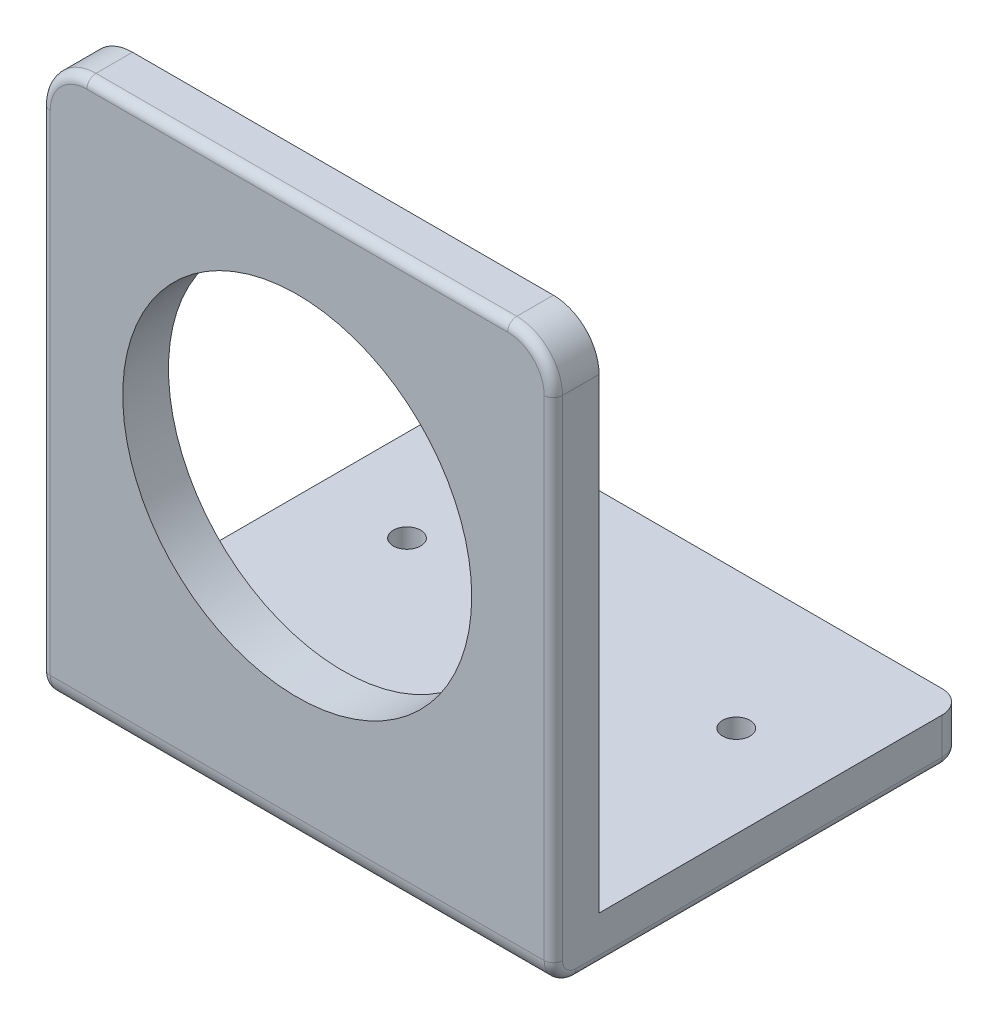
ISO-10303-21;
HEADER;
FILE_DESCRIPTION(('STEP AP214'),'2;1');
FILE_NAME('part.step','',(''),(''),'','','');
FILE_SCHEMA(('AUTOMOTIVE_DESIGN { 1 0 10303 214 1 1 1 1 }'));
ENDSEC;
DATA;
#1=APPLICATION_CONTEXT('core data for automotive mechanical design processes');
#2=APPLICATION_PROTOCOL_DEFINITION('international standard','automotive_design',2000,#1);
#3=PRODUCT_CONTEXT('',#1,'mechanical');
#4=PRODUCT('Part','Part','',(#3));
#5=PRODUCT_RELATED_PRODUCT_CATEGORY('part','',(#4));
#6=PRODUCT_DEFINITION_FORMATION('','',#4);
#7=PRODUCT_DEFINITION_CONTEXT('part definition',#1,'design');
#8=PRODUCT_DEFINITION('design','',#6,#7);
#9=PRODUCT_DEFINITION_SHAPE('','',#8);
#10=(LENGTH_UNIT() NAMED_UNIT(*) SI_UNIT(.MILLI.,.METRE.));
#11=(NAMED_UNIT(*) PLANE_ANGLE_UNIT() SI_UNIT($,.RADIAN.));
#12=(NAMED_UNIT(*) SI_UNIT($,.STERADIAN.) SOLID_ANGLE_UNIT());
#13=UNCERTAINTY_MEASURE_WITH_UNIT(LENGTH_MEASURE(1.E-05),#10,'distance_accuracy_value','');
#14=(GEOMETRIC_REPRESENTATION_CONTEXT(3) GLOBAL_UNCERTAINTY_ASSIGNED_CONTEXT((#13)) GLOBAL_UNIT_ASSIGNED_CONTEXT((#10,
#11,#12)) REPRESENTATION_CONTEXT('',''));
#15=CARTESIAN_POINT('',(0.,0.,0.));
#16=DIRECTION('',(0.,0.,1.));
#17=DIRECTION('',(1.,0.,0.));
#18=AXIS2_PLACEMENT_3D('',#15,#16,#17);
#19=CARTESIAN_POINT('',(28.,23.,5.));
#20=DIRECTION('',(-1.,0.,0.));
#21=DIRECTION('',(0.,-1.,0.));
#22=AXIS2_PLACEMENT_3D('',#19,#20,#21);
#23=PLANE('',#22);
#24=DIRECTION('',(0.,0.,-1.));
#25=VECTOR('',#24,1.);
#26=CARTESIAN_POINT('',(28.,23.,5.));
#27=LINE('',#26,#25);
#28=CARTESIAN_POINT('',(28.,23.,4.));
#29=VERTEX_POINT('',#28);
#30=CARTESIAN_POINT('',(28.,23.,0.));
#31=VERTEX_POINT('',#30);
#32=EDGE_CURVE('E209',#29,#31,#27,.T.);
#33=ORIENTED_EDGE('',*,*,#32,.F.);
#34=DIRECTION('',(0.,1.,0.));
#35=VECTOR('',#34,1.);
#36=CARTESIAN_POINT('',(28.,-30.5,4.));
#37=LINE('',#36,#35);
#38=CARTESIAN_POINT('',(28.,-30.5,4.));
#39=VERTEX_POINT('',#38);
#40=EDGE_CURVE('E251',#29,#39,#37,.F.);
#41=ORIENTED_EDGE('',*,*,#40,.T.);
#42=CARTESIAN_POINT('',(28.,-30.5,2.5));
#43=DIRECTION('',(-1.,0.,0.));
#44=DIRECTION('',(0.,-1.,0.));
#45=AXIS2_PLACEMENT_3D('',#42,#43,#44);
#46=CIRCLE('',#45,1.5);
#47=CARTESIAN_POINT('',(28.,-32.,2.5));
#48=VERTEX_POINT('',#47);
#49=EDGE_CURVE('E249',#39,#48,#46,.F.);
#50=ORIENTED_EDGE('',*,*,#49,.T.);
#51=DIRECTION('',(0.,0.,1.));
#52=VECTOR('',#51,1.);
#53=CARTESIAN_POINT('',(28.,-32.,-37.5));
#54=LINE('',#53,#52);
#55=CARTESIAN_POINT('',(28.,-32.,-37.5));
#56=VERTEX_POINT('',#55);
#57=EDGE_CURVE('E247',#48,#56,#54,.F.);
#58=ORIENTED_EDGE('',*,*,#57,.T.);
#59=DIRECTION('',(0.,-1.,0.));
#60=VECTOR('',#59,1.);
#61=CARTESIAN_POINT('',(28.,-28.,-37.5));
#62=LINE('',#61,#60);
#63=CARTESIAN_POINT('',(28.,-28.,-37.5));
#64=VERTEX_POINT('',#63);
#65=EDGE_CURVE('E159',#56,#64,#62,.F.);
#66=ORIENTED_EDGE('',*,*,#65,.T.);
#67=DIRECTION('',(0.,0.,1.));
#68=VECTOR('',#67,1.);
#69=CARTESIAN_POINT('',(28.,-28.,-50.));
#70=LINE('',#69,#68);
#71=CARTESIAN_POINT('',(28.,-28.,0.));
#72=VERTEX_POINT('',#71);
#73=EDGE_CURVE('E153',#64,#72,#70,.T.);
#74=ORIENTED_EDGE('',*,*,#73,.T.);
#75=DIRECTION('',(0.,1.,0.));
#76=VECTOR('',#75,1.);
#77=CARTESIAN_POINT('',(28.,23.,0.));
#78=LINE('',#77,#76);
#79=EDGE_CURVE('E156',#72,#31,#78,.T.);
#80=ORIENTED_EDGE('',*,*,#79,.T.);
#81=EDGE_LOOP('',(#33,#41,#50,#58,#66,#74,#80));
#82=FACE_BOUND('',#81,.T.);
#83=ADVANCED_FACE('F35',(#82),#23,.F.);
#84=CARTESIAN_POINT('',(-28.,23.,5.));
#85=DIRECTION('',(1.,0.,0.));
#86=DIRECTION('',(0.,1.,0.));
#87=AXIS2_PLACEMENT_3D('',#84,#85,#86);
#88=PLANE('',#87);
#89=DIRECTION('',(0.,1.,0.));
#90=VECTOR('',#89,1.);
#91=CARTESIAN_POINT('',(-28.,-33.,-37.5));
#92=LINE('',#91,#90);
#93=CARTESIAN_POINT('',(-28.,-28.,-37.5));
#94=VERTEX_POINT('',#93);
#95=CARTESIAN_POINT('',(-28.,-32.,-37.5));
#96=VERTEX_POINT('',#95);
#97=EDGE_CURVE('E226',#94,#96,#92,.F.);
#98=ORIENTED_EDGE('',*,*,#97,.T.);
#99=DIRECTION('',(0.,0.,-1.));
#100=VECTOR('',#99,1.);
#101=CARTESIAN_POINT('',(-28.,-32.,2.5));
#102=LINE('',#101,#100);
#103=CARTESIAN_POINT('',(-28.,-32.,2.5));
#104=VERTEX_POINT('',#103);
#105=EDGE_CURVE('E11',#96,#104,#102,.F.);
#106=ORIENTED_EDGE('',*,*,#105,.T.);
#107=CARTESIAN_POINT('',(-28.,-30.5,2.5));
#108=DIRECTION('',(1.,0.,0.));
#109=DIRECTION('',(0.,1.,0.));
#110=AXIS2_PLACEMENT_3D('',#107,#108,#109);
#111=CIRCLE('',#110,1.5);
#112=CARTESIAN_POINT('',(-28.,-30.5,4.));
#113=VERTEX_POINT('',#112);
#114=EDGE_CURVE('E44',#104,#113,#111,.F.);
#115=ORIENTED_EDGE('',*,*,#114,.T.);
#116=DIRECTION('',(0.,-1.,0.));
#117=VECTOR('',#116,1.);
#118=CARTESIAN_POINT('',(-28.,23.,4.));
#119=LINE('',#118,#117);
#120=CARTESIAN_POINT('',(-28.,23.,4.));
#121=VERTEX_POINT('',#120);
#122=EDGE_CURVE('E273',#113,#121,#119,.F.);
#123=ORIENTED_EDGE('',*,*,#122,.T.);
#124=DIRECTION('',(0.,0.,-1.));
#125=VECTOR('',#124,1.);
#126=CARTESIAN_POINT('',(-28.,23.,5.));
#127=LINE('',#126,#125);
#128=CARTESIAN_POINT('',(-28.,23.,0.));
#129=VERTEX_POINT('',#128);
#130=EDGE_CURVE('E203',#121,#129,#127,.T.);
#131=ORIENTED_EDGE('',*,*,#130,.T.);
#132=DIRECTION('',(0.,-1.,0.));
#133=VECTOR('',#132,1.);
#134=CARTESIAN_POINT('',(-28.,23.,0.));
#135=LINE('',#134,#133);
#136=CARTESIAN_POINT('',(-28.,-28.,0.));
#137=VERTEX_POINT('',#136);
#138=EDGE_CURVE('E201',#129,#137,#135,.T.);
#139=ORIENTED_EDGE('',*,*,#138,.T.);
#140=DIRECTION('',(0.,0.,1.));
#141=VECTOR('',#140,1.);
#142=CARTESIAN_POINT('',(-28.,-28.,-50.));
#143=LINE('',#142,#141);
#144=EDGE_CURVE('E163',#94,#137,#143,.T.);
#145=ORIENTED_EDGE('',*,*,#144,.F.);
#146=EDGE_LOOP('',(#98,#106,#115,#123,#131,#139,#145));
#147=FACE_BOUND('',#146,.T.);
#148=ADVANCED_FACE('F353',(#147),#88,.F.);
#149=CARTESIAN_POINT('',(0.,-33.,0.));
#150=DIRECTION('',(0.,-1.,0.));
#151=DIRECTION('',(0.,0.,-1.));
#152=AXIS2_PLACEMENT_3D('',#149,#150,#151);
#153=PLANE('',#152);
#154=CARTESIAN_POINT('',(-18.,-33.,-25.));
#155=DIRECTION('',(0.,1.,0.));
#156=DIRECTION('',(0.,0.,1.));
#157=AXIS2_PLACEMENT_3D('',#154,#155,#156);
#158=CIRCLE('',#157,1.5);
#159=CARTESIAN_POINT('',(-18.,-33.,-23.5));
#160=VERTEX_POINT('',#159);
#161=EDGE_CURVE('E179',#160,#160,#158,.T.);
#162=ORIENTED_EDGE('',*,*,#161,.T.);
#163=EDGE_LOOP('',(#162));
#164=FACE_BOUND('',#163,.T.);
#165=CARTESIAN_POINT('',(18.,-33.,-25.));
#166=DIRECTION('',(0.,1.,0.));
#167=DIRECTION('',(0.,0.,-1.));
#168=AXIS2_PLACEMENT_3D('',#165,#166,#167);
#169=CIRCLE('',#168,1.49999999999999);
#170=CARTESIAN_POINT('',(18.,-33.,-26.5));
#171=VERTEX_POINT('',#170);
#172=EDGE_CURVE('E320',#171,#171,#169,.T.);
#173=ORIENTED_EDGE('',*,*,#172,.T.);
#174=EDGE_LOOP('',(#173));
#175=FACE_BOUND('',#174,.T.);
#176=CARTESIAN_POINT('',(25.5,-33.,-37.5));
#177=DIRECTION('',(0.,-1.,0.));
#178=DIRECTION('',(0.,0.,-1.));
#179=AXIS2_PLACEMENT_3D('',#176,#177,#178);
#180=CIRCLE('',#179,1.5);
#181=CARTESIAN_POINT('',(25.5,-33.,-39.));
#182=VERTEX_POINT('',#181);
#183=CARTESIAN_POINT('',(27.,-33.,-37.5));
#184=VERTEX_POINT('',#183);
#185=EDGE_CURVE('E263',#182,#184,#180,.T.);
#186=ORIENTED_EDGE('',*,*,#185,.T.);
#187=DIRECTION('',(0.,0.,1.));
#188=VECTOR('',#187,1.);
#189=CARTESIAN_POINT('',(27.,-33.,2.5));
#190=LINE('',#189,#188);
#191=CARTESIAN_POINT('',(27.,-33.,2.5));
#192=VERTEX_POINT('',#191);
#193=EDGE_CURVE('E265',#184,#192,#190,.T.);
#194=ORIENTED_EDGE('',*,*,#193,.T.);
#195=DIRECTION('',(-1.,0.,0.));
#196=VECTOR('',#195,1.);
#197=CARTESIAN_POINT('',(0.,-33.,2.5));
#198=LINE('',#197,#196);
#199=CARTESIAN_POINT('',(-27.,-33.,2.5));
#200=VERTEX_POINT('',#199);
#201=EDGE_CURVE('E211',#192,#200,#198,.T.);
#202=ORIENTED_EDGE('',*,*,#201,.T.);
#203=DIRECTION('',(0.,0.,-1.));
#204=VECTOR('',#203,1.);
#205=CARTESIAN_POINT('',(-27.,-33.,-37.5));
#206=LINE('',#205,#204);
#207=CARTESIAN_POINT('',(-27.,-33.,-37.5));
#208=VERTEX_POINT('',#207);
#209=EDGE_CURVE('E257',#200,#208,#206,.T.);
#210=ORIENTED_EDGE('',*,*,#209,.T.);
#211=CARTESIAN_POINT('',(-25.5,-33.,-37.5));
#212=DIRECTION('',(0.,-1.,0.));
#213=DIRECTION('',(0.,0.,-1.));
#214=AXIS2_PLACEMENT_3D('',#211,#212,#213);
#215=CIRCLE('',#214,1.5);
#216=CARTESIAN_POINT('',(-25.5,-33.,-39.));
#217=VERTEX_POINT('',#216);
#218=EDGE_CURVE('E259',#208,#217,#215,.T.);
#219=ORIENTED_EDGE('',*,*,#218,.T.);
#220=DIRECTION('',(-1.,0.,0.));
#221=VECTOR('',#220,1.);
#222=CARTESIAN_POINT('',(0.,-33.,-39.));
#223=LINE('',#222,#221);
#224=EDGE_CURVE('E261',#217,#182,#223,.F.);
#225=ORIENTED_EDGE('',*,*,#224,.T.);
#226=EDGE_LOOP('',(#186,#194,#202,#210,#219,#225));
#227=FACE_BOUND('',#226,.T.);
#228=ADVANCED_FACE('F326',(#164,#175,#227),#153,.T.);
#229=CARTESIAN_POINT('',(28.,-28.,-50.));
#230=DIRECTION('',(0.,-1.,0.));
#231=DIRECTION('',(0.,0.,-1.));
#232=AXIS2_PLACEMENT_3D('',#229,#230,#231);
#233=PLANE('',#232);
#234=CARTESIAN_POINT('',(18.,-28.,-25.));
#235=DIRECTION('',(0.,1.,0.));
#236=DIRECTION('',(0.,0.,-1.));
#237=AXIS2_PLACEMENT_3D('',#234,#235,#236);
#238=CIRCLE('',#237,1.49999999999999);
#239=CARTESIAN_POINT('',(18.,-28.,-26.5));
#240=VERTEX_POINT('',#239);
#241=EDGE_CURVE('E185',#240,#240,#238,.T.);
#242=ORIENTED_EDGE('',*,*,#241,.F.);
#243=EDGE_LOOP('',(#242));
#244=FACE_BOUND('',#243,.T.);
#245=CARTESIAN_POINT('',(-18.,-28.,-25.));
#246=DIRECTION('',(0.,1.,0.));
#247=DIRECTION('',(0.,0.,1.));
#248=AXIS2_PLACEMENT_3D('',#245,#246,#247);
#249=CIRCLE('',#248,1.5);
#250=CARTESIAN_POINT('',(-18.,-28.,-23.5));
#251=VERTEX_POINT('',#250);
#252=EDGE_CURVE('E182',#251,#251,#249,.T.);
#253=ORIENTED_EDGE('',*,*,#252,.F.);
#254=EDGE_LOOP('',(#253));
#255=FACE_BOUND('',#254,.T.);
#256=DIRECTION('',(1.,0.,0.));
#257=VECTOR('',#256,1.);
#258=CARTESIAN_POINT('',(-28.,-28.,-40.));
#259=LINE('',#258,#257);
#260=CARTESIAN_POINT('',(-25.5,-28.,-40.));
#261=VERTEX_POINT('',#260);
#262=CARTESIAN_POINT('',(25.5,-28.,-40.));
#263=VERTEX_POINT('',#262);
#264=EDGE_CURVE('E310',#261,#263,#259,.T.);
#265=ORIENTED_EDGE('',*,*,#264,.F.);
#266=CARTESIAN_POINT('',(-25.5,-28.,-37.5));
#267=DIRECTION('',(0.,-1.,0.));
#268=DIRECTION('',(0.,0.,-1.));
#269=AXIS2_PLACEMENT_3D('',#266,#267,#268);
#270=CIRCLE('',#269,2.5);
#271=EDGE_CURVE('E224',#261,#94,#270,.F.);
#272=ORIENTED_EDGE('',*,*,#271,.T.);
#273=ORIENTED_EDGE('',*,*,#144,.T.);
#274=DIRECTION('',(1.,0.,0.));
#275=VECTOR('',#274,1.);
#276=CARTESIAN_POINT('',(28.,-28.,0.));
#277=LINE('',#276,#275);
#278=EDGE_CURVE('E164',#137,#72,#277,.T.);
#279=ORIENTED_EDGE('',*,*,#278,.T.);
#280=ORIENTED_EDGE('',*,*,#73,.F.);
#281=CARTESIAN_POINT('',(25.5,-28.,-37.5));
#282=DIRECTION('',(0.,-1.,0.));
#283=DIRECTION('',(0.,0.,-1.));
#284=AXIS2_PLACEMENT_3D('',#281,#282,#283);
#285=CIRCLE('',#284,2.5);
#286=EDGE_CURVE('E222',#64,#263,#285,.F.);
#287=ORIENTED_EDGE('',*,*,#286,.T.);
#288=EDGE_LOOP('',(#265,#272,#273,#279,#280,#287));
#289=FACE_BOUND('',#288,.T.);
#290=ADVANCED_FACE('F177',(#244,#255,#289),#233,.F.);
#291=CARTESIAN_POINT('',(-23.,23.,0.));
#292=DIRECTION('',(0.,0.,1.));
#293=DIRECTION('',(1.,0.,0.));
#294=AXIS2_PLACEMENT_3D('',#291,#292,#293);
#295=PLANE('',#294);
#296=CARTESIAN_POINT('',(0.,0.,0.));
#297=DIRECTION('',(0.,0.,1.));
#298=DIRECTION('',(1.,0.,0.));
#299=AXIS2_PLACEMENT_3D('',#296,#297,#298);
#300=CIRCLE('',#299,19.075);
#301=CARTESIAN_POINT('',(19.075,0.,0.));
#302=VERTEX_POINT('',#301);
#303=EDGE_CURVE('E189',#302,#302,#300,.T.);
#304=ORIENTED_EDGE('',*,*,#303,.T.);
#305=EDGE_LOOP('',(#304));
#306=FACE_BOUND('',#305,.T.);
#307=ORIENTED_EDGE('',*,*,#278,.F.);
#308=ORIENTED_EDGE('',*,*,#138,.F.);
#309=CARTESIAN_POINT('',(-23.,23.,0.));
#310=DIRECTION('',(0.,0.,1.));
#311=DIRECTION('',(1.,0.,0.));
#312=AXIS2_PLACEMENT_3D('',#309,#310,#311);
#313=CIRCLE('',#312,5.);
#314=CARTESIAN_POINT('',(-23.,28.,0.));
#315=VERTEX_POINT('',#314);
#316=EDGE_CURVE('E198',#315,#129,#313,.T.);
#317=ORIENTED_EDGE('',*,*,#316,.F.);
#318=DIRECTION('',(-1.,0.,0.));
#319=VECTOR('',#318,1.);
#320=CARTESIAN_POINT('',(-23.,28.,0.));
#321=LINE('',#320,#319);
#322=CARTESIAN_POINT('',(23.,28.,0.));
#323=VERTEX_POINT('',#322);
#324=EDGE_CURVE('E195',#323,#315,#321,.T.);
#325=ORIENTED_EDGE('',*,*,#324,.F.);
#326=CARTESIAN_POINT('',(23.,23.,0.));
#327=DIRECTION('',(0.,0.,1.));
#328=DIRECTION('',(-1.,0.,0.));
#329=AXIS2_PLACEMENT_3D('',#326,#327,#328);
#330=CIRCLE('',#329,5.);
#331=EDGE_CURVE('E173',#31,#323,#330,.T.);
#332=ORIENTED_EDGE('',*,*,#331,.F.);
#333=ORIENTED_EDGE('',*,*,#79,.F.);
#334=EDGE_LOOP('',(#307,#308,#317,#325,#332,#333));
#335=FACE_BOUND('',#334,.T.);
#336=ADVANCED_FACE('F168',(#306,#335),#295,.F.);
#337=CARTESIAN_POINT('',(-23.,23.,5.));
#338=DIRECTION('',(0.,0.,1.));
#339=DIRECTION('',(1.,0.,0.));
#340=AXIS2_PLACEMENT_3D('',#337,#338,#339);
#341=PLANE('',#340);
#342=DIRECTION('',(-1.,0.,0.));
#343=VECTOR('',#342,1.);
#344=CARTESIAN_POINT('',(-23.,-30.5,5.));
#345=LINE('',#344,#343);
#346=CARTESIAN_POINT('',(-27.,-30.5,5.));
#347=VERTEX_POINT('',#346);
#348=CARTESIAN_POINT('',(27.,-30.5,5.));
#349=VERTEX_POINT('',#348);
#350=EDGE_CURVE('E214',#347,#349,#345,.F.);
#351=ORIENTED_EDGE('',*,*,#350,.T.);
#352=DIRECTION('',(0.,1.,0.));
#353=VECTOR('',#352,1.);
#354=CARTESIAN_POINT('',(27.,23.,5.));
#355=LINE('',#354,#353);
#356=CARTESIAN_POINT('',(27.,23.,5.));
#357=VERTEX_POINT('',#356);
#358=EDGE_CURVE('E238',#349,#357,#355,.T.);
#359=ORIENTED_EDGE('',*,*,#358,.T.);
#360=CARTESIAN_POINT('',(23.,23.,5.));
#361=DIRECTION('',(0.,0.,1.));
#362=DIRECTION('',(1.,0.,0.));
#363=AXIS2_PLACEMENT_3D('',#360,#361,#362);
#364=CIRCLE('',#363,4.);
#365=CARTESIAN_POINT('',(23.,27.,5.));
#366=VERTEX_POINT('',#365);
#367=EDGE_CURVE('E236',#357,#366,#364,.T.);
#368=ORIENTED_EDGE('',*,*,#367,.T.);
#369=DIRECTION('',(-1.,0.,0.));
#370=VECTOR('',#369,1.);
#371=CARTESIAN_POINT('',(-23.,27.,5.));
#372=LINE('',#371,#370);
#373=CARTESIAN_POINT('',(-23.,27.,5.));
#374=VERTEX_POINT('',#373);
#375=EDGE_CURVE('E234',#366,#374,#372,.T.);
#376=ORIENTED_EDGE('',*,*,#375,.T.);
#377=CARTESIAN_POINT('',(-23.,23.,5.));
#378=DIRECTION('',(0.,0.,1.));
#379=DIRECTION('',(1.,0.,0.));
#380=AXIS2_PLACEMENT_3D('',#377,#378,#379);
#381=CIRCLE('',#380,4.);
#382=CARTESIAN_POINT('',(-27.,23.,5.));
#383=VERTEX_POINT('',#382);
#384=EDGE_CURVE('E231',#374,#383,#381,.T.);
#385=ORIENTED_EDGE('',*,*,#384,.T.);
#386=DIRECTION('',(0.,-1.,0.));
#387=VECTOR('',#386,1.);
#388=CARTESIAN_POINT('',(-27.,-30.5,5.));
#389=LINE('',#388,#387);
#390=EDGE_CURVE('E229',#383,#347,#389,.T.);
#391=ORIENTED_EDGE('',*,*,#390,.T.);
#392=EDGE_LOOP('',(#351,#359,#368,#376,#385,#391));
#393=FACE_BOUND('',#392,.T.);
#394=CARTESIAN_POINT('',(0.,0.,5.));
#395=DIRECTION('',(0.,0.,1.));
#396=DIRECTION('',(1.,0.,0.));
#397=AXIS2_PLACEMENT_3D('',#394,#395,#396);
#398=CIRCLE('',#397,19.075);
#399=CARTESIAN_POINT('',(19.075,0.,5.));
#400=VERTEX_POINT('',#399);
#401=EDGE_CURVE('E174',#400,#400,#398,.T.);
#402=ORIENTED_EDGE('',*,*,#401,.F.);
#403=EDGE_LOOP('',(#402));
#404=FACE_BOUND('',#403,.T.);
#405=ADVANCED_FACE('F449',(#393,#404),#341,.T.);
#406=CARTESIAN_POINT('',(23.,23.,5.));
#407=DIRECTION('',(0.,0.,-1.));
#408=DIRECTION('',(-1.,0.,0.));
#409=AXIS2_PLACEMENT_3D('',#406,#407,#408);
#410=CYLINDRICAL_SURFACE('',#409,5.);
#411=DIRECTION('',(0.,0.,-1.));
#412=VECTOR('',#411,1.);
#413=CARTESIAN_POINT('',(23.,28.,5.));
#414=LINE('',#413,#412);
#415=CARTESIAN_POINT('',(23.,28.,4.));
#416=VERTEX_POINT('',#415);
#417=EDGE_CURVE('E207',#416,#323,#414,.T.);
#418=ORIENTED_EDGE('',*,*,#417,.F.);
#419=CARTESIAN_POINT('',(23.,23.,4.));
#420=DIRECTION('',(0.,0.,1.));
#421=DIRECTION('',(1.,0.,0.));
#422=AXIS2_PLACEMENT_3D('',#419,#420,#421);
#423=CIRCLE('',#422,5.);
#424=EDGE_CURVE('E245',#416,#29,#423,.F.);
#425=ORIENTED_EDGE('',*,*,#424,.T.);
#426=ORIENTED_EDGE('',*,*,#32,.T.);
#427=ORIENTED_EDGE('',*,*,#331,.T.);
#428=EDGE_LOOP('',(#418,#425,#426,#427));
#429=FACE_BOUND('',#428,.T.);
#430=ADVANCED_FACE('F361',(#429),#410,.T.);
#431=CARTESIAN_POINT('',(-23.,28.,5.));
#432=DIRECTION('',(0.,-1.,0.));
#433=DIRECTION('',(0.,0.,-1.));
#434=AXIS2_PLACEMENT_3D('',#431,#432,#433);
#435=PLANE('',#434);
#436=DIRECTION('',(0.,0.,-1.));
#437=VECTOR('',#436,1.);
#438=CARTESIAN_POINT('',(-23.,28.,5.));
#439=LINE('',#438,#437);
#440=CARTESIAN_POINT('',(-23.,28.,4.));
#441=VERTEX_POINT('',#440);
#442=EDGE_CURVE('E205',#441,#315,#439,.T.);
#443=ORIENTED_EDGE('',*,*,#442,.F.);
#444=DIRECTION('',(-1.,0.,0.));
#445=VECTOR('',#444,1.);
#446=CARTESIAN_POINT('',(23.,28.,4.));
#447=LINE('',#446,#445);
#448=EDGE_CURVE('E243',#441,#416,#447,.F.);
#449=ORIENTED_EDGE('',*,*,#448,.T.);
#450=ORIENTED_EDGE('',*,*,#417,.T.);
#451=ORIENTED_EDGE('',*,*,#324,.T.);
#452=EDGE_LOOP('',(#443,#449,#450,#451));
#453=FACE_BOUND('',#452,.T.);
#454=ADVANCED_FACE('F435',(#453),#435,.F.);
#455=CARTESIAN_POINT('',(-23.,23.,5.));
#456=DIRECTION('',(0.,0.,-1.));
#457=DIRECTION('',(-1.,0.,0.));
#458=AXIS2_PLACEMENT_3D('',#455,#456,#457);
#459=CYLINDRICAL_SURFACE('',#458,5.);
#460=ORIENTED_EDGE('',*,*,#130,.F.);
#461=CARTESIAN_POINT('',(-23.,23.,4.));
#462=DIRECTION('',(0.,0.,1.));
#463=DIRECTION('',(1.,0.,0.));
#464=AXIS2_PLACEMENT_3D('',#461,#462,#463);
#465=CIRCLE('',#464,5.);
#466=EDGE_CURVE('E240',#121,#441,#465,.F.);
#467=ORIENTED_EDGE('',*,*,#466,.T.);
#468=ORIENTED_EDGE('',*,*,#442,.T.);
#469=ORIENTED_EDGE('',*,*,#316,.T.);
#470=EDGE_LOOP('',(#460,#467,#468,#469));
#471=FACE_BOUND('',#470,.T.);
#472=ADVANCED_FACE('F431',(#471),#459,.T.);
#473=CARTESIAN_POINT('',(0.,0.,5.));
#474=DIRECTION('',(0.,0.,-1.));
#475=DIRECTION('',(-1.,0.,0.));
#476=AXIS2_PLACEMENT_3D('',#473,#474,#475);
#477=CYLINDRICAL_SURFACE('',#476,19.075);
#478=ORIENTED_EDGE('',*,*,#401,.T.);
#479=EDGE_LOOP('',(#478));
#480=FACE_BOUND('',#479,.T.);
#481=ORIENTED_EDGE('',*,*,#303,.F.);
#482=EDGE_LOOP('',(#481));
#483=FACE_BOUND('',#482,.T.);
#484=ADVANCED_FACE('F365',(#480,#483),#477,.F.);
#485=CARTESIAN_POINT('',(0.,-30.5,2.5));
#486=DIRECTION('',(-1.,0.,0.));
#487=DIRECTION('',(0.,0.,1.));
#488=AXIS2_PLACEMENT_3D('',#485,#486,#487);
#489=CYLINDRICAL_SURFACE('',#488,2.5);
#490=ORIENTED_EDGE('',*,*,#201,.F.);
#491=CARTESIAN_POINT('',(27.,-30.5,2.5));
#492=DIRECTION('',(-1.,0.,0.));
#493=DIRECTION('',(0.,-1.,0.));
#494=AXIS2_PLACEMENT_3D('',#491,#492,#493);
#495=CIRCLE('',#494,2.5);
#496=EDGE_CURVE('E255',#192,#349,#495,.T.);
#497=ORIENTED_EDGE('',*,*,#496,.T.);
#498=ORIENTED_EDGE('',*,*,#350,.F.);
#499=CARTESIAN_POINT('',(-27.,-30.5,2.5));
#500=DIRECTION('',(1.,0.,0.));
#501=DIRECTION('',(0.,1.,0.));
#502=AXIS2_PLACEMENT_3D('',#499,#500,#501);
#503=CIRCLE('',#502,2.5);
#504=EDGE_CURVE('E253',#347,#200,#503,.T.);
#505=ORIENTED_EDGE('',*,*,#504,.T.);
#506=EDGE_LOOP('',(#490,#497,#498,#505));
#507=FACE_BOUND('',#506,.T.);
#508=ADVANCED_FACE('F333',(#507),#489,.T.);
#509=CARTESIAN_POINT('',(18.,-33.,-25.));
#510=DIRECTION('',(0.,1.,0.));
#511=DIRECTION('',(0.,0.,1.));
#512=AXIS2_PLACEMENT_3D('',#509,#510,#511);
#513=CYLINDRICAL_SURFACE('',#512,1.49999999999999);
#514=ORIENTED_EDGE('',*,*,#172,.F.);
#515=EDGE_LOOP('',(#514));
#516=FACE_BOUND('',#515,.T.);
#517=ORIENTED_EDGE('',*,*,#241,.T.);
#518=EDGE_LOOP('',(#517));
#519=FACE_BOUND('',#518,.T.);
#520=ADVANCED_FACE('F329',(#516,#519),#513,.F.);
#521=CARTESIAN_POINT('',(-18.,-33.,-25.));
#522=DIRECTION('',(0.,1.,0.));
#523=DIRECTION('',(0.,0.,1.));
#524=AXIS2_PLACEMENT_3D('',#521,#522,#523);
#525=CYLINDRICAL_SURFACE('',#524,1.5);
#526=ORIENTED_EDGE('',*,*,#161,.F.);
#527=EDGE_LOOP('',(#526));
#528=FACE_BOUND('',#527,.T.);
#529=ORIENTED_EDGE('',*,*,#252,.T.);
#530=EDGE_LOOP('',(#529));
#531=FACE_BOUND('',#530,.T.);
#532=ADVANCED_FACE('F332',(#528,#531),#525,.F.);
#533=CARTESIAN_POINT('',(0.,0.,-40.));
#534=DIRECTION('',(0.,0.,-1.));
#535=DIRECTION('',(-1.,0.,0.));
#536=AXIS2_PLACEMENT_3D('',#533,#534,#535);
#537=PLANE('',#536);
#538=DIRECTION('',(0.,-1.,0.));
#539=VECTOR('',#538,1.);
#540=CARTESIAN_POINT('',(25.5,-33.,-40.));
#541=LINE('',#540,#539);
#542=CARTESIAN_POINT('',(25.5,-32.,-40.));
#543=VERTEX_POINT('',#542);
#544=EDGE_CURVE('E217',#263,#543,#541,.T.);
#545=ORIENTED_EDGE('',*,*,#544,.T.);
#546=DIRECTION('',(-1.,0.,0.));
#547=VECTOR('',#546,1.);
#548=CARTESIAN_POINT('',(0.,-32.,-40.));
#549=LINE('',#548,#547);
#550=CARTESIAN_POINT('',(-25.5,-32.,-40.));
#551=VERTEX_POINT('',#550);
#552=EDGE_CURVE('E269',#543,#551,#549,.T.);
#553=ORIENTED_EDGE('',*,*,#552,.T.);
#554=DIRECTION('',(0.,1.,0.));
#555=VECTOR('',#554,1.);
#556=CARTESIAN_POINT('',(-25.5,-28.,-40.));
#557=LINE('',#556,#555);
#558=EDGE_CURVE('E220',#551,#261,#557,.T.);
#559=ORIENTED_EDGE('',*,*,#558,.T.);
#560=ORIENTED_EDGE('',*,*,#264,.T.);
#561=EDGE_LOOP('',(#545,#553,#559,#560));
#562=FACE_BOUND('',#561,.T.);
#563=ADVANCED_FACE('F343',(#562),#537,.T.);
#564=CARTESIAN_POINT('',(-25.5,0.,-37.5));
#565=DIRECTION('',(0.,-1.,0.));
#566=DIRECTION('',(1.,0.,0.));
#567=AXIS2_PLACEMENT_3D('',#564,#565,#566);
#568=CYLINDRICAL_SURFACE('',#567,2.5);
#569=ORIENTED_EDGE('',*,*,#558,.F.);
#570=CARTESIAN_POINT('',(-25.5,-32.,-37.5));
#571=DIRECTION('',(0.,-1.,0.));
#572=DIRECTION('',(0.,0.,-1.));
#573=AXIS2_PLACEMENT_3D('',#570,#571,#572);
#574=CIRCLE('',#573,2.5);
#575=EDGE_CURVE('E271',#551,#96,#574,.F.);
#576=ORIENTED_EDGE('',*,*,#575,.T.);
#577=ORIENTED_EDGE('',*,*,#97,.F.);
#578=ORIENTED_EDGE('',*,*,#271,.F.);
#579=EDGE_LOOP('',(#569,#576,#577,#578));
#580=FACE_BOUND('',#579,.T.);
#581=ADVANCED_FACE('F349',(#580),#568,.T.);
#582=CARTESIAN_POINT('',(25.5,0.,-37.5));
#583=DIRECTION('',(0.,1.,0.));
#584=DIRECTION('',(-1.,0.,0.));
#585=AXIS2_PLACEMENT_3D('',#582,#583,#584);
#586=CYLINDRICAL_SURFACE('',#585,2.5);
#587=ORIENTED_EDGE('',*,*,#65,.F.);
#588=CARTESIAN_POINT('',(25.5,-32.,-37.5));
#589=DIRECTION('',(0.,-1.,0.));
#590=DIRECTION('',(0.,0.,-1.));
#591=AXIS2_PLACEMENT_3D('',#588,#589,#590);
#592=CIRCLE('',#591,2.5);
#593=EDGE_CURVE('E267',#56,#543,#592,.F.);
#594=ORIENTED_EDGE('',*,*,#593,.T.);
#595=ORIENTED_EDGE('',*,*,#544,.F.);
#596=ORIENTED_EDGE('',*,*,#286,.F.);
#597=EDGE_LOOP('',(#587,#594,#595,#596));
#598=FACE_BOUND('',#597,.T.);
#599=ADVANCED_FACE('F369',(#598),#586,.T.);
#600=CARTESIAN_POINT('',(25.5,-32.,-37.5));
#601=DIRECTION('',(0.,-1.,0.));
#602=DIRECTION('',(0.,0.,-1.));
#603=AXIS2_PLACEMENT_3D('',#600,#601,#602);
#604=TOROIDAL_SURFACE('',#603,1.5,1.);
#605=CARTESIAN_POINT('',(25.5,-32.,-39.));
#606=DIRECTION('',(-1.,0.,0.));
#607=DIRECTION('',(0.,0.,1.));
#608=AXIS2_PLACEMENT_3D('',#605,#606,#607);
#609=CIRCLE('',#608,1.);
#610=EDGE_CURVE('E303',#543,#182,#609,.T.);
#611=ORIENTED_EDGE('',*,*,#610,.F.);
#612=ORIENTED_EDGE('',*,*,#593,.F.);
#613=CARTESIAN_POINT('',(27.,-32.,-37.5));
#614=DIRECTION('',(0.,0.,1.));
#615=DIRECTION('',(1.,0.,0.));
#616=AXIS2_PLACEMENT_3D('',#613,#614,#615);
#617=CIRCLE('',#616,1.);
#618=EDGE_CURVE('E39',#184,#56,#617,.T.);
#619=ORIENTED_EDGE('',*,*,#618,.F.);
#620=ORIENTED_EDGE('',*,*,#185,.F.);
#621=EDGE_LOOP('',(#611,#612,#619,#620));
#622=FACE_BOUND('',#621,.T.);
#623=ADVANCED_FACE('F37',(#622),#604,.T.);
#624=CARTESIAN_POINT('',(27.,-32.,0.));
#625=DIRECTION('',(0.,0.,-1.));
#626=DIRECTION('',(-1.,0.,0.));
#627=AXIS2_PLACEMENT_3D('',#624,#625,#626);
#628=CYLINDRICAL_SURFACE('',#627,1.);
#629=ORIENTED_EDGE('',*,*,#618,.T.);
#630=ORIENTED_EDGE('',*,*,#57,.F.);
#631=CARTESIAN_POINT('',(27.,-32.,2.5));
#632=DIRECTION('',(0.,0.,1.));
#633=DIRECTION('',(1.,0.,0.));
#634=AXIS2_PLACEMENT_3D('',#631,#632,#633);
#635=CIRCLE('',#634,1.);
#636=EDGE_CURVE('E301',#192,#48,#635,.T.);
#637=ORIENTED_EDGE('',*,*,#636,.F.);
#638=ORIENTED_EDGE('',*,*,#193,.F.);
#639=EDGE_LOOP('',(#629,#630,#637,#638));
#640=FACE_BOUND('',#639,.T.);
#641=ADVANCED_FACE('F412',(#640),#628,.T.);
#642=CARTESIAN_POINT('',(0.,-32.,-39.));
#643=DIRECTION('',(-1.,0.,0.));
#644=DIRECTION('',(0.,0.,1.));
#645=AXIS2_PLACEMENT_3D('',#642,#643,#644);
#646=CYLINDRICAL_SURFACE('',#645,1.);
#647=ORIENTED_EDGE('',*,*,#610,.T.);
#648=ORIENTED_EDGE('',*,*,#224,.F.);
#649=CARTESIAN_POINT('',(-25.5,-32.,-39.));
#650=DIRECTION('',(-1.,0.,0.));
#651=DIRECTION('',(0.,0.,1.));
#652=AXIS2_PLACEMENT_3D('',#649,#650,#651);
#653=CIRCLE('',#652,1.);
#654=EDGE_CURVE('E298',#551,#217,#653,.T.);
#655=ORIENTED_EDGE('',*,*,#654,.F.);
#656=ORIENTED_EDGE('',*,*,#552,.F.);
#657=EDGE_LOOP('',(#647,#648,#655,#656));
#658=FACE_BOUND('',#657,.T.);
#659=ADVANCED_FACE('F409',(#658),#646,.T.);
#660=CARTESIAN_POINT('',(27.,-30.5,2.5));
#661=DIRECTION('',(-1.,0.,0.));
#662=DIRECTION('',(0.,-1.,0.));
#663=AXIS2_PLACEMENT_3D('',#660,#661,#662);
#664=TOROIDAL_SURFACE('',#663,1.5,1.);
#665=ORIENTED_EDGE('',*,*,#636,.T.);
#666=ORIENTED_EDGE('',*,*,#49,.F.);
#667=CARTESIAN_POINT('',(27.,-30.5,4.));
#668=DIRECTION('',(0.,1.,0.));
#669=DIRECTION('',(0.,0.,1.));
#670=AXIS2_PLACEMENT_3D('',#667,#668,#669);
#671=CIRCLE('',#670,1.);
#672=EDGE_CURVE('E295',#349,#39,#671,.T.);
#673=ORIENTED_EDGE('',*,*,#672,.F.);
#674=ORIENTED_EDGE('',*,*,#496,.F.);
#675=EDGE_LOOP('',(#665,#666,#673,#674));
#676=FACE_BOUND('',#675,.T.);
#677=ADVANCED_FACE('F405',(#676),#664,.T.);
#678=CARTESIAN_POINT('',(-25.5,-32.,-37.5));
#679=DIRECTION('',(0.,-1.,0.));
#680=DIRECTION('',(0.,0.,-1.));
#681=AXIS2_PLACEMENT_3D('',#678,#679,#680);
#682=TOROIDAL_SURFACE('',#681,1.5,1.);
#683=ORIENTED_EDGE('',*,*,#654,.T.);
#684=ORIENTED_EDGE('',*,*,#218,.F.);
#685=CARTESIAN_POINT('',(-27.,-32.,-37.5));
#686=DIRECTION('',(0.,0.,1.));
#687=DIRECTION('',(1.,0.,0.));
#688=AXIS2_PLACEMENT_3D('',#685,#686,#687);
#689=CIRCLE('',#688,1.);
#690=EDGE_CURVE('E292',#96,#208,#689,.T.);
#691=ORIENTED_EDGE('',*,*,#690,.F.);
#692=ORIENTED_EDGE('',*,*,#575,.F.);
#693=EDGE_LOOP('',(#683,#684,#691,#692));
#694=FACE_BOUND('',#693,.T.);
#695=ADVANCED_FACE('F401',(#694),#682,.T.);
#696=CARTESIAN_POINT('',(27.,23.,4.));
#697=DIRECTION('',(0.,-1.,0.));
#698=DIRECTION('',(1.,0.,0.));
#699=AXIS2_PLACEMENT_3D('',#696,#697,#698);
#700=CYLINDRICAL_SURFACE('',#699,1.);
#701=ORIENTED_EDGE('',*,*,#672,.T.);
#702=ORIENTED_EDGE('',*,*,#40,.F.);
#703=CARTESIAN_POINT('',(27.,23.,4.));
#704=DIRECTION('',(0.,1.,0.));
#705=DIRECTION('',(-1.,0.,0.));
#706=AXIS2_PLACEMENT_3D('',#703,#704,#705);
#707=CIRCLE('',#706,1.);
#708=EDGE_CURVE('E289',#357,#29,#707,.T.);
#709=ORIENTED_EDGE('',*,*,#708,.F.);
#710=ORIENTED_EDGE('',*,*,#358,.F.);
#711=EDGE_LOOP('',(#701,#702,#709,#710));
#712=FACE_BOUND('',#711,.T.);
#713=ADVANCED_FACE('F397',(#712),#700,.T.);
#714=CARTESIAN_POINT('',(-27.,-32.,0.));
#715=DIRECTION('',(0.,0.,1.));
#716=DIRECTION('',(1.,0.,0.));
#717=AXIS2_PLACEMENT_3D('',#714,#715,#716);
#718=CYLINDRICAL_SURFACE('',#717,1.);
#719=ORIENTED_EDGE('',*,*,#690,.T.);
#720=ORIENTED_EDGE('',*,*,#209,.F.);
#721=CARTESIAN_POINT('',(-27.,-32.,2.5));
#722=DIRECTION('',(0.,0.,1.));
#723=DIRECTION('',(1.,0.,0.));
#724=AXIS2_PLACEMENT_3D('',#721,#722,#723);
#725=CIRCLE('',#724,1.);
#726=EDGE_CURVE('E286',#104,#200,#725,.T.);
#727=ORIENTED_EDGE('',*,*,#726,.F.);
#728=ORIENTED_EDGE('',*,*,#105,.F.);
#729=EDGE_LOOP('',(#719,#720,#727,#728));
#730=FACE_BOUND('',#729,.T.);
#731=ADVANCED_FACE('F393',(#730),#718,.T.);
#732=CARTESIAN_POINT('',(23.,23.,4.));
#733=DIRECTION('',(0.,0.,1.));
#734=DIRECTION('',(1.,0.,0.));
#735=AXIS2_PLACEMENT_3D('',#732,#733,#734);
#736=TOROIDAL_SURFACE('',#735,4.,1.);
#737=ORIENTED_EDGE('',*,*,#708,.T.);
#738=ORIENTED_EDGE('',*,*,#424,.F.);
#739=CARTESIAN_POINT('',(23.,27.,4.));
#740=DIRECTION('',(-1.,0.,0.));
#741=DIRECTION('',(0.,0.,1.));
#742=AXIS2_PLACEMENT_3D('',#739,#740,#741);
#743=CIRCLE('',#742,1.);
#744=EDGE_CURVE('E283',#366,#416,#743,.T.);
#745=ORIENTED_EDGE('',*,*,#744,.F.);
#746=ORIENTED_EDGE('',*,*,#367,.F.);
#747=EDGE_LOOP('',(#737,#738,#745,#746));
#748=FACE_BOUND('',#747,.T.);
#749=ADVANCED_FACE('F389',(#748),#736,.T.);
#750=CARTESIAN_POINT('',(-27.,-30.5,2.5));
#751=DIRECTION('',(1.,0.,0.));
#752=DIRECTION('',(0.,1.,0.));
#753=AXIS2_PLACEMENT_3D('',#750,#751,#752);
#754=TOROIDAL_SURFACE('',#753,1.5,1.);
#755=ORIENTED_EDGE('',*,*,#726,.T.);
#756=ORIENTED_EDGE('',*,*,#504,.F.);
#757=CARTESIAN_POINT('',(-27.,-30.5,4.));
#758=DIRECTION('',(0.,1.,0.));
#759=DIRECTION('',(0.,0.,1.));
#760=AXIS2_PLACEMENT_3D('',#757,#758,#759);
#761=CIRCLE('',#760,1.);
#762=EDGE_CURVE('E280',#113,#347,#761,.T.);
#763=ORIENTED_EDGE('',*,*,#762,.F.);
#764=ORIENTED_EDGE('',*,*,#114,.F.);
#765=EDGE_LOOP('',(#755,#756,#763,#764));
#766=FACE_BOUND('',#765,.T.);
#767=ADVANCED_FACE('F385',(#766),#754,.T.);
#768=CARTESIAN_POINT('',(-23.,27.,4.));
#769=DIRECTION('',(1.,0.,0.));
#770=DIRECTION('',(0.,0.,-1.));
#771=AXIS2_PLACEMENT_3D('',#768,#769,#770);
#772=CYLINDRICAL_SURFACE('',#771,1.);
#773=ORIENTED_EDGE('',*,*,#744,.T.);
#774=ORIENTED_EDGE('',*,*,#448,.F.);
#775=CARTESIAN_POINT('',(-23.,27.,4.));
#776=DIRECTION('',(-1.,0.,0.));
#777=DIRECTION('',(0.,-1.,0.));
#778=AXIS2_PLACEMENT_3D('',#775,#776,#777);
#779=CIRCLE('',#778,1.);
#780=EDGE_CURVE('E278',#374,#441,#779,.T.);
#781=ORIENTED_EDGE('',*,*,#780,.F.);
#782=ORIENTED_EDGE('',*,*,#375,.F.);
#783=EDGE_LOOP('',(#773,#774,#781,#782));
#784=FACE_BOUND('',#783,.T.);
#785=ADVANCED_FACE('F381',(#784),#772,.T.);
#786=CARTESIAN_POINT('',(-27.,23.,4.));
#787=DIRECTION('',(0.,1.,0.));
#788=DIRECTION('',(-1.,0.,0.));
#789=AXIS2_PLACEMENT_3D('',#786,#787,#788);
#790=CYLINDRICAL_SURFACE('',#789,1.);
#791=ORIENTED_EDGE('',*,*,#762,.T.);
#792=ORIENTED_EDGE('',*,*,#390,.F.);
#793=CARTESIAN_POINT('',(-27.,23.,4.));
#794=DIRECTION('',(0.,1.,0.));
#795=DIRECTION('',(0.,0.,1.));
#796=AXIS2_PLACEMENT_3D('',#793,#794,#795);
#797=CIRCLE('',#796,1.);
#798=EDGE_CURVE('E276',#121,#383,#797,.T.);
#799=ORIENTED_EDGE('',*,*,#798,.F.);
#800=ORIENTED_EDGE('',*,*,#122,.F.);
#801=EDGE_LOOP('',(#791,#792,#799,#800));
#802=FACE_BOUND('',#801,.T.);
#803=ADVANCED_FACE('F377',(#802),#790,.T.);
#804=CARTESIAN_POINT('',(-23.,23.,4.));
#805=DIRECTION('',(0.,0.,1.));
#806=DIRECTION('',(1.,0.,0.));
#807=AXIS2_PLACEMENT_3D('',#804,#805,#806);
#808=TOROIDAL_SURFACE('',#807,4.,1.);
#809=ORIENTED_EDGE('',*,*,#780,.T.);
#810=ORIENTED_EDGE('',*,*,#466,.F.);
#811=ORIENTED_EDGE('',*,*,#798,.T.);
#812=ORIENTED_EDGE('',*,*,#384,.F.);
#813=EDGE_LOOP('',(#809,#810,#811,#812));
#814=FACE_BOUND('',#813,.T.);
#815=ADVANCED_FACE('F374',(#814),#808,.T.);
#816=CLOSED_SHELL('',(#83,#148,#228,#290,#336,#405,#430,#454,#472,#484,#508,#520,#532,#563,#581,
#599,#623,#641,#659,#677,#695,#713,#731,#749,#767,#785,#803,#815));
#817=MANIFOLD_SOLID_BREP('B2',#816);
#818=ADVANCED_BREP_SHAPE_REPRESENTATION('',(#18,#817),#14);
#819=SHAPE_DEFINITION_REPRESENTATION(#9,#818);
ENDSEC;
END-ISO-10303-21;
